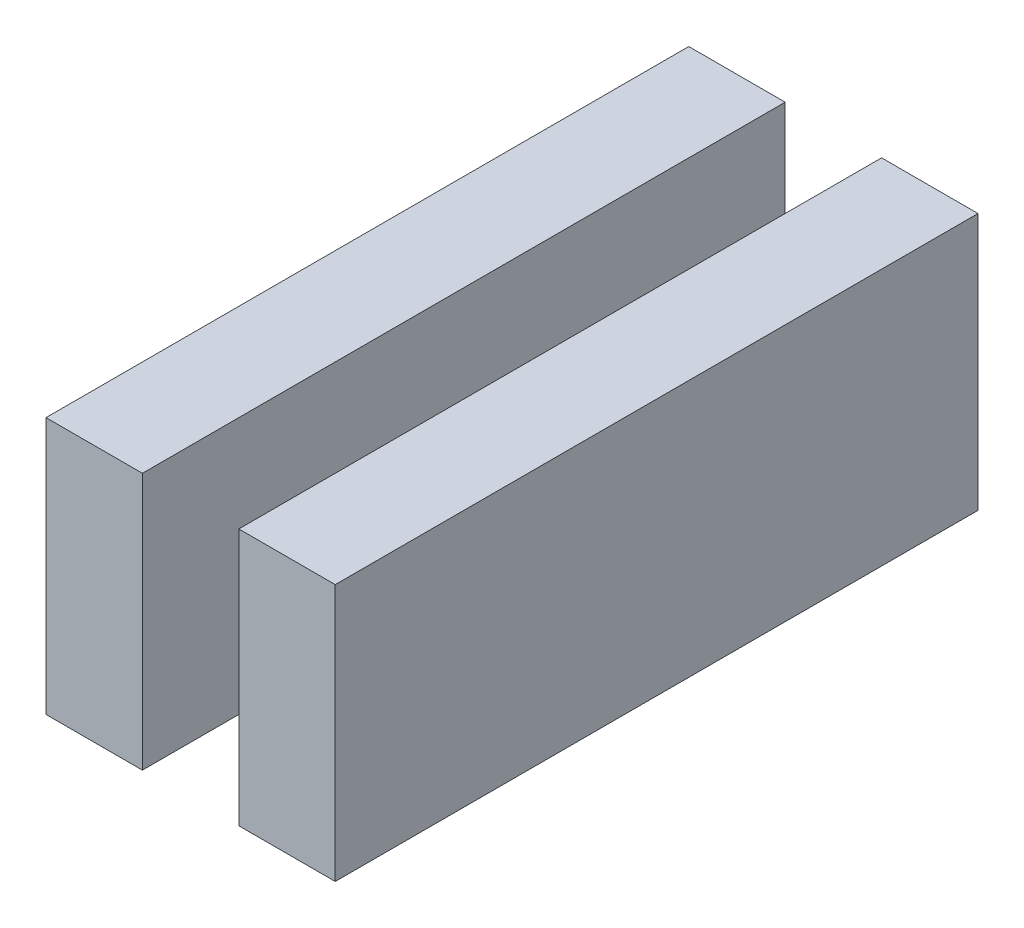
ISO-10303-21;
HEADER;
FILE_DESCRIPTION(('STEP AP214'),'2;1');
FILE_NAME('part.step','',(''),(''),'','','');
FILE_SCHEMA(('AUTOMOTIVE_DESIGN { 1 0 10303 214 1 1 1 1 }'));
ENDSEC;
DATA;
#1=APPLICATION_CONTEXT('core data for automotive mechanical design processes');
#2=APPLICATION_PROTOCOL_DEFINITION('international standard','automotive_design',2000,#1);
#3=PRODUCT_CONTEXT('',#1,'mechanical');
#4=PRODUCT('Part','Part','',(#3));
#5=PRODUCT_RELATED_PRODUCT_CATEGORY('part','',(#4));
#6=PRODUCT_DEFINITION_FORMATION('','',#4);
#7=PRODUCT_DEFINITION_CONTEXT('part definition',#1,'design');
#8=PRODUCT_DEFINITION('design','',#6,#7);
#9=PRODUCT_DEFINITION_SHAPE('','',#8);
#10=(LENGTH_UNIT() NAMED_UNIT(*) SI_UNIT(.MILLI.,.METRE.));
#11=(NAMED_UNIT(*) PLANE_ANGLE_UNIT() SI_UNIT($,.RADIAN.));
#12=(NAMED_UNIT(*) SI_UNIT($,.STERADIAN.) SOLID_ANGLE_UNIT());
#13=UNCERTAINTY_MEASURE_WITH_UNIT(LENGTH_MEASURE(1.E-05),#10,'distance_accuracy_value','');
#14=(GEOMETRIC_REPRESENTATION_CONTEXT(3) GLOBAL_UNCERTAINTY_ASSIGNED_CONTEXT((#13)) GLOBAL_UNIT_ASSIGNED_CONTEXT((#10,
#11,#12)) REPRESENTATION_CONTEXT('',''));
#15=CARTESIAN_POINT('',(0.,0.,0.));
#16=DIRECTION('',(0.,0.,1.));
#17=DIRECTION('',(1.,0.,0.));
#18=AXIS2_PLACEMENT_3D('',#15,#16,#17);
#19=CARTESIAN_POINT('',(47.75,94.5,10.));
#20=DIRECTION('',(0.,-1.,0.));
#21=DIRECTION('',(0.,0.,-1.));
#22=AXIS2_PLACEMENT_3D('',#19,#20,#21);
#23=PLANE('',#22);
#24=DIRECTION('',(-1.,0.,0.));
#25=VECTOR('',#24,1.);
#26=CARTESIAN_POINT('',(47.75,94.5,0.));
#27=LINE('',#26,#25);
#28=CARTESIAN_POINT('',(47.75,94.5,0.));
#29=VERTEX_POINT('',#28);
#30=CARTESIAN_POINT('',(46.25,94.5,0.));
#31=VERTEX_POINT('',#30);
#32=EDGE_CURVE('E12',#29,#31,#27,.T.);
#33=ORIENTED_EDGE('',*,*,#32,.T.);
#34=DIRECTION('',(0.,0.,-1.));
#35=VECTOR('',#34,1.);
#36=CARTESIAN_POINT('',(46.25,94.5,10.));
#37=LINE('',#36,#35);
#38=CARTESIAN_POINT('',(46.25,94.5,10.));
#39=VERTEX_POINT('',#38);
#40=EDGE_CURVE('E132',#39,#31,#37,.T.);
#41=ORIENTED_EDGE('',*,*,#40,.F.);
#42=DIRECTION('',(-1.,0.,0.));
#43=VECTOR('',#42,1.);
#44=CARTESIAN_POINT('',(47.75,94.5,10.));
#45=LINE('',#44,#43);
#46=CARTESIAN_POINT('',(47.75,94.5,10.));
#47=VERTEX_POINT('',#46);
#48=EDGE_CURVE('E54',#47,#39,#45,.T.);
#49=ORIENTED_EDGE('',*,*,#48,.F.);
#50=DIRECTION('',(0.,0.,-1.));
#51=VECTOR('',#50,1.);
#52=CARTESIAN_POINT('',(47.75,94.5,10.));
#53=LINE('',#52,#51);
#54=EDGE_CURVE('E95',#47,#29,#53,.T.);
#55=ORIENTED_EDGE('',*,*,#54,.T.);
#56=EDGE_LOOP('',(#33,#41,#49,#55));
#57=FACE_BOUND('',#56,.T.);
#58=ADVANCED_FACE('F50',(#57),#23,.F.);
#59=CARTESIAN_POINT('',(46.25,94.5,10.));
#60=DIRECTION('',(1.,0.,0.));
#61=DIRECTION('',(0.,0.,-1.));
#62=AXIS2_PLACEMENT_3D('',#59,#60,#61);
#63=PLANE('',#62);
#64=DIRECTION('',(0.,-1.,0.));
#65=VECTOR('',#64,1.);
#66=CARTESIAN_POINT('',(46.25,94.5,0.));
#67=LINE('',#66,#65);
#68=CARTESIAN_POINT('',(46.25,90.5,0.));
#69=VERTEX_POINT('',#68);
#70=EDGE_CURVE('E61',#31,#69,#67,.T.);
#71=ORIENTED_EDGE('',*,*,#70,.T.);
#72=DIRECTION('',(0.,0.,-1.));
#73=VECTOR('',#72,1.);
#74=CARTESIAN_POINT('',(46.25,90.5,10.));
#75=LINE('',#74,#73);
#76=CARTESIAN_POINT('',(46.25,90.5,10.));
#77=VERTEX_POINT('',#76);
#78=EDGE_CURVE('E110',#77,#69,#75,.T.);
#79=ORIENTED_EDGE('',*,*,#78,.F.);
#80=DIRECTION('',(0.,-1.,0.));
#81=VECTOR('',#80,1.);
#82=CARTESIAN_POINT('',(46.25,94.5,10.));
#83=LINE('',#82,#81);
#84=EDGE_CURVE('E87',#39,#77,#83,.T.);
#85=ORIENTED_EDGE('',*,*,#84,.F.);
#86=ORIENTED_EDGE('',*,*,#40,.T.);
#87=EDGE_LOOP('',(#71,#79,#85,#86));
#88=FACE_BOUND('',#87,.T.);
#89=ADVANCED_FACE('F136',(#88),#63,.F.);
#90=CARTESIAN_POINT('',(47.75,90.5,10.));
#91=DIRECTION('',(0.,-1.,0.));
#92=DIRECTION('',(0.,0.,-1.));
#93=AXIS2_PLACEMENT_3D('',#90,#91,#92);
#94=PLANE('',#93);
#95=DIRECTION('',(-1.,0.,0.));
#96=VECTOR('',#95,1.);
#97=CARTESIAN_POINT('',(47.75,90.5,0.));
#98=LINE('',#97,#96);
#99=CARTESIAN_POINT('',(47.75,90.5,0.));
#100=VERTEX_POINT('',#99);
#101=EDGE_CURVE('E112',#100,#69,#98,.T.);
#102=ORIENTED_EDGE('',*,*,#101,.F.);
#103=DIRECTION('',(0.,0.,-1.));
#104=VECTOR('',#103,1.);
#105=CARTESIAN_POINT('',(47.75,90.5,10.));
#106=LINE('',#105,#104);
#107=CARTESIAN_POINT('',(47.75,90.5,10.));
#108=VERTEX_POINT('',#107);
#109=EDGE_CURVE('E100',#108,#100,#106,.T.);
#110=ORIENTED_EDGE('',*,*,#109,.F.);
#111=DIRECTION('',(-1.,0.,0.));
#112=VECTOR('',#111,1.);
#113=CARTESIAN_POINT('',(47.75,90.5,10.));
#114=LINE('',#113,#112);
#115=EDGE_CURVE('E126',#108,#77,#114,.T.);
#116=ORIENTED_EDGE('',*,*,#115,.T.);
#117=ORIENTED_EDGE('',*,*,#78,.T.);
#118=EDGE_LOOP('',(#102,#110,#116,#117));
#119=FACE_BOUND('',#118,.T.);
#120=ADVANCED_FACE('F113',(#119),#94,.T.);
#121=CARTESIAN_POINT('',(47.75,94.5,10.));
#122=DIRECTION('',(1.,0.,0.));
#123=DIRECTION('',(0.,1.,0.));
#124=AXIS2_PLACEMENT_3D('',#121,#122,#123);
#125=PLANE('',#124);
#126=DIRECTION('',(0.,-1.,0.));
#127=VECTOR('',#126,1.);
#128=CARTESIAN_POINT('',(47.75,94.5,0.));
#129=LINE('',#128,#127);
#130=EDGE_CURVE('E104',#29,#100,#129,.T.);
#131=ORIENTED_EDGE('',*,*,#130,.F.);
#132=ORIENTED_EDGE('',*,*,#54,.F.);
#133=DIRECTION('',(0.,-1.,0.));
#134=VECTOR('',#133,1.);
#135=CARTESIAN_POINT('',(47.75,94.5,10.));
#136=LINE('',#135,#134);
#137=EDGE_CURVE('E106',#47,#108,#136,.T.);
#138=ORIENTED_EDGE('',*,*,#137,.T.);
#139=ORIENTED_EDGE('',*,*,#109,.T.);
#140=EDGE_LOOP('',(#131,#132,#138,#139));
#141=FACE_BOUND('',#140,.T.);
#142=ADVANCED_FACE('F102',(#141),#125,.T.);
#143=CARTESIAN_POINT('',(0.,0.,10.));
#144=DIRECTION('',(0.,0.,1.));
#145=DIRECTION('',(1.,0.,0.));
#146=AXIS2_PLACEMENT_3D('',#143,#144,#145);
#147=PLANE('',#146);
#148=ORIENTED_EDGE('',*,*,#48,.T.);
#149=ORIENTED_EDGE('',*,*,#84,.T.);
#150=ORIENTED_EDGE('',*,*,#115,.F.);
#151=ORIENTED_EDGE('',*,*,#137,.F.);
#152=EDGE_LOOP('',(#148,#149,#150,#151));
#153=FACE_BOUND('',#152,.T.);
#154=ADVANCED_FACE('F52',(#153),#147,.T.);
#155=CARTESIAN_POINT('',(0.,0.,0.));
#156=DIRECTION('',(0.,0.,1.));
#157=DIRECTION('',(1.,0.,0.));
#158=AXIS2_PLACEMENT_3D('',#155,#156,#157);
#159=PLANE('',#158);
#160=ORIENTED_EDGE('',*,*,#32,.F.);
#161=ORIENTED_EDGE('',*,*,#130,.T.);
#162=ORIENTED_EDGE('',*,*,#101,.T.);
#163=ORIENTED_EDGE('',*,*,#70,.F.);
#164=EDGE_LOOP('',(#160,#161,#162,#163));
#165=FACE_BOUND('',#164,.T.);
#166=ADVANCED_FACE('F116',(#165),#159,.F.);
#167=CLOSED_SHELL('',(#58,#89,#120,#142,#154,#166));
#168=MANIFOLD_SOLID_BREP('B2',#167);
#169=CARTESIAN_POINT('',(50.75,0.,10.));
#170=DIRECTION('',(1.,0.,0.));
#171=DIRECTION('',(0.,0.,-1.));
#172=AXIS2_PLACEMENT_3D('',#169,#170,#171);
#173=PLANE('',#172);
#174=DIRECTION('',(0.,-1.,0.));
#175=VECTOR('',#174,1.);
#176=CARTESIAN_POINT('',(50.75,0.,0.));
#177=LINE('',#176,#175);
#178=CARTESIAN_POINT('',(50.75,94.5,0.));
#179=VERTEX_POINT('',#178);
#180=CARTESIAN_POINT('',(50.75,90.5,0.));
#181=VERTEX_POINT('',#180);
#182=EDGE_CURVE('E248',#179,#181,#177,.T.);
#183=ORIENTED_EDGE('',*,*,#182,.F.);
#184=DIRECTION('',(0.,0.,-1.));
#185=VECTOR('',#184,1.);
#186=CARTESIAN_POINT('',(50.75,94.5,10.));
#187=LINE('',#186,#185);
#188=CARTESIAN_POINT('',(50.75,94.5,10.));
#189=VERTEX_POINT('',#188);
#190=EDGE_CURVE('E48',#189,#179,#187,.T.);
#191=ORIENTED_EDGE('',*,*,#190,.F.);
#192=DIRECTION('',(0.,-1.,0.));
#193=VECTOR('',#192,1.);
#194=CARTESIAN_POINT('',(50.75,0.,10.));
#195=LINE('',#194,#193);
#196=CARTESIAN_POINT('',(50.75,90.5,10.));
#197=VERTEX_POINT('',#196);
#198=EDGE_CURVE('E242',#189,#197,#195,.T.);
#199=ORIENTED_EDGE('',*,*,#198,.T.);
#200=DIRECTION('',(0.,0.,-1.));
#201=VECTOR('',#200,1.);
#202=CARTESIAN_POINT('',(50.75,90.5,10.));
#203=LINE('',#202,#201);
#204=EDGE_CURVE('E223',#197,#181,#203,.T.);
#205=ORIENTED_EDGE('',*,*,#204,.T.);
#206=EDGE_LOOP('',(#183,#191,#199,#205));
#207=FACE_BOUND('',#206,.T.);
#208=ADVANCED_FACE('F185',(#207),#173,.T.);
#209=CARTESIAN_POINT('',(-8.74300631892306E-13,94.4999999999995,10.));
#210=DIRECTION('',(0.,1.,0.));
#211=DIRECTION('',(-1.,0.,0.));
#212=AXIS2_PLACEMENT_3D('',#209,#210,#211);
#213=PLANE('',#212);
#214=DIRECTION('',(1.,0.,0.));
#215=VECTOR('',#214,1.);
#216=CARTESIAN_POINT('',(-8.74300631892306E-13,94.4999999999995,0.));
#217=LINE('',#216,#215);
#218=CARTESIAN_POINT('',(49.25,94.5,0.));
#219=VERTEX_POINT('',#218);
#220=EDGE_CURVE('E236',#219,#179,#217,.T.);
#221=ORIENTED_EDGE('',*,*,#220,.F.);
#222=DIRECTION('',(0.,0.,-1.));
#223=VECTOR('',#222,1.);
#224=CARTESIAN_POINT('',(49.25,94.5,10.));
#225=LINE('',#224,#223);
#226=CARTESIAN_POINT('',(49.25,94.5,10.));
#227=VERTEX_POINT('',#226);
#228=EDGE_CURVE('E193',#227,#219,#225,.T.);
#229=ORIENTED_EDGE('',*,*,#228,.F.);
#230=DIRECTION('',(1.,0.,0.));
#231=VECTOR('',#230,1.);
#232=CARTESIAN_POINT('',(-8.74300631892306E-13,94.4999999999995,10.));
#233=LINE('',#232,#231);
#234=EDGE_CURVE('E234',#227,#189,#233,.T.);
#235=ORIENTED_EDGE('',*,*,#234,.T.);
#236=ORIENTED_EDGE('',*,*,#190,.T.);
#237=EDGE_LOOP('',(#221,#229,#235,#236));
#238=FACE_BOUND('',#237,.T.);
#239=ADVANCED_FACE('F232',(#238),#213,.T.);
#240=CARTESIAN_POINT('',(49.2500000000002,0.,10.));
#241=DIRECTION('',(1.,0.,0.));
#242=DIRECTION('',(0.,1.,0.));
#243=AXIS2_PLACEMENT_3D('',#240,#241,#242);
#244=PLANE('',#243);
#245=DIRECTION('',(0.,-1.,0.));
#246=VECTOR('',#245,1.);
#247=CARTESIAN_POINT('',(49.2500000000002,0.,0.));
#248=LINE('',#247,#246);
#249=CARTESIAN_POINT('',(49.25,90.5,0.));
#250=VERTEX_POINT('',#249);
#251=EDGE_CURVE('E216',#219,#250,#248,.T.);
#252=ORIENTED_EDGE('',*,*,#251,.T.);
#253=DIRECTION('',(0.,0.,-1.));
#254=VECTOR('',#253,1.);
#255=CARTESIAN_POINT('',(49.25,90.5,10.));
#256=LINE('',#255,#254);
#257=CARTESIAN_POINT('',(49.25,90.5,10.));
#258=VERTEX_POINT('',#257);
#259=EDGE_CURVE('E237',#258,#250,#256,.T.);
#260=ORIENTED_EDGE('',*,*,#259,.F.);
#261=DIRECTION('',(0.,-1.,0.));
#262=VECTOR('',#261,1.);
#263=CARTESIAN_POINT('',(49.2500000000002,0.,10.));
#264=LINE('',#263,#262);
#265=EDGE_CURVE('E238',#227,#258,#264,.T.);
#266=ORIENTED_EDGE('',*,*,#265,.F.);
#267=ORIENTED_EDGE('',*,*,#228,.T.);
#268=EDGE_LOOP('',(#252,#260,#266,#267));
#269=FACE_BOUND('',#268,.T.);
#270=ADVANCED_FACE('F239',(#269),#244,.F.);
#271=CARTESIAN_POINT('',(0.,90.5,10.));
#272=DIRECTION('',(0.,1.,0.));
#273=DIRECTION('',(0.,0.,1.));
#274=AXIS2_PLACEMENT_3D('',#271,#272,#273);
#275=PLANE('',#274);
#276=DIRECTION('',(1.,0.,0.));
#277=VECTOR('',#276,1.);
#278=CARTESIAN_POINT('',(0.,90.5,0.));
#279=LINE('',#278,#277);
#280=EDGE_CURVE('E244',#250,#181,#279,.T.);
#281=ORIENTED_EDGE('',*,*,#280,.T.);
#282=ORIENTED_EDGE('',*,*,#204,.F.);
#283=DIRECTION('',(1.,0.,0.));
#284=VECTOR('',#283,1.);
#285=CARTESIAN_POINT('',(0.,90.5,10.));
#286=LINE('',#285,#284);
#287=EDGE_CURVE('E201',#258,#197,#286,.T.);
#288=ORIENTED_EDGE('',*,*,#287,.F.);
#289=ORIENTED_EDGE('',*,*,#259,.T.);
#290=EDGE_LOOP('',(#281,#282,#288,#289));
#291=FACE_BOUND('',#290,.T.);
#292=ADVANCED_FACE('F257',(#291),#275,.F.);
#293=CARTESIAN_POINT('',(0.,0.,10.));
#294=DIRECTION('',(0.,0.,1.));
#295=DIRECTION('',(1.,0.,0.));
#296=AXIS2_PLACEMENT_3D('',#293,#294,#295);
#297=PLANE('',#296);
#298=ORIENTED_EDGE('',*,*,#198,.F.);
#299=ORIENTED_EDGE('',*,*,#234,.F.);
#300=ORIENTED_EDGE('',*,*,#265,.T.);
#301=ORIENTED_EDGE('',*,*,#287,.T.);
#302=EDGE_LOOP('',(#298,#299,#300,#301));
#303=FACE_BOUND('',#302,.T.);
#304=ADVANCED_FACE('F241',(#303),#297,.T.);
#305=CARTESIAN_POINT('',(0.,0.,0.));
#306=DIRECTION('',(0.,0.,1.));
#307=DIRECTION('',(1.,0.,0.));
#308=AXIS2_PLACEMENT_3D('',#305,#306,#307);
#309=PLANE('',#308);
#310=ORIENTED_EDGE('',*,*,#182,.T.);
#311=ORIENTED_EDGE('',*,*,#280,.F.);
#312=ORIENTED_EDGE('',*,*,#251,.F.);
#313=ORIENTED_EDGE('',*,*,#220,.T.);
#314=EDGE_LOOP('',(#310,#311,#312,#313));
#315=FACE_BOUND('',#314,.T.);
#316=ADVANCED_FACE('F259',(#315),#309,.F.);
#317=CLOSED_SHELL('',(#208,#239,#270,#292,#304,#316));
#318=MANIFOLD_SOLID_BREP('B6',#317);
#319=ADVANCED_BREP_SHAPE_REPRESENTATION('',(#18,#168,#318),#14);
#320=SHAPE_DEFINITION_REPRESENTATION(#9,#319);
ENDSEC;
END-ISO-10303-21;
